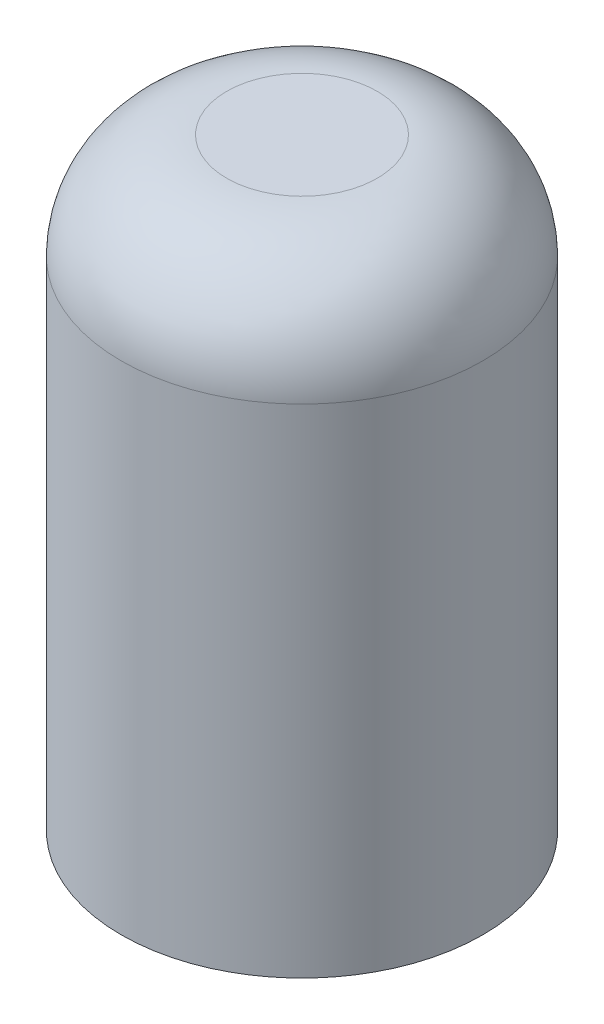
ISO-10303-21;
HEADER;
FILE_DESCRIPTION(('STEP AP214'),'2;1');
FILE_NAME('part.step','',(''),(''),'','','');
FILE_SCHEMA(('AUTOMOTIVE_DESIGN { 1 0 10303 214 1 1 1 1 }'));
ENDSEC;
DATA;
#1=APPLICATION_CONTEXT('core data for automotive mechanical design processes');
#2=APPLICATION_PROTOCOL_DEFINITION('international standard','automotive_design',2000,#1);
#3=PRODUCT_CONTEXT('',#1,'mechanical');
#4=PRODUCT('Part','Part','',(#3));
#5=PRODUCT_RELATED_PRODUCT_CATEGORY('part','',(#4));
#6=PRODUCT_DEFINITION_FORMATION('','',#4);
#7=PRODUCT_DEFINITION_CONTEXT('part definition',#1,'design');
#8=PRODUCT_DEFINITION('design','',#6,#7);
#9=PRODUCT_DEFINITION_SHAPE('','',#8);
#10=(LENGTH_UNIT() NAMED_UNIT(*) SI_UNIT(.MILLI.,.METRE.));
#11=(NAMED_UNIT(*) PLANE_ANGLE_UNIT() SI_UNIT($,.RADIAN.));
#12=(NAMED_UNIT(*) SI_UNIT($,.STERADIAN.) SOLID_ANGLE_UNIT());
#13=UNCERTAINTY_MEASURE_WITH_UNIT(LENGTH_MEASURE(1.E-05),#10,'distance_accuracy_value','');
#14=(GEOMETRIC_REPRESENTATION_CONTEXT(3) GLOBAL_UNCERTAINTY_ASSIGNED_CONTEXT((#13)) GLOBAL_UNIT_ASSIGNED_CONTEXT((#10,
#11,#12)) REPRESENTATION_CONTEXT('',''));
#15=CARTESIAN_POINT('',(0.,0.,0.));
#16=DIRECTION('',(0.,0.,1.));
#17=DIRECTION('',(1.,0.,0.));
#18=AXIS2_PLACEMENT_3D('',#15,#16,#17);
#19=CARTESIAN_POINT('',(0.,0.,0.));
#20=DIRECTION('',(0.,1.,0.));
#21=DIRECTION('',(-1.,0.,0.));
#22=AXIS2_PLACEMENT_3D('',#19,#20,#21);
#23=PLANE('',#22);
#24=CARTESIAN_POINT('',(0.,0.,0.));
#25=DIRECTION('',(0.,1.,0.));
#26=DIRECTION('',(-1.,0.,0.));
#27=AXIS2_PLACEMENT_3D('',#24,#25,#26);
#28=CIRCLE('',#27,57.9999999999998);
#29=CARTESIAN_POINT('',(-57.9999999999998,2.56578741862219E-13,0.));
#30=VERTEX_POINT('',#29);
#31=EDGE_CURVE('E45',#30,#30,#28,.T.);
#32=ORIENTED_EDGE('',*,*,#31,.T.);
#33=EDGE_LOOP('',(#32));
#34=FACE_BOUND('',#33,.T.);
#35=CARTESIAN_POINT('',(0.,1.66533453693773E-13,0.));
#36=DIRECTION('',(0.,1.,0.));
#37=DIRECTION('',(-1.,0.,0.));
#38=AXIS2_PLACEMENT_3D('',#35,#36,#37);
#39=CIRCLE('',#38,60.0000000000001);
#40=CARTESIAN_POINT('',(-60.0000000000001,3.45821745088946E-13,0.));
#41=VERTEX_POINT('',#40);
#42=EDGE_CURVE('E10',#41,#41,#39,.T.);
#43=ORIENTED_EDGE('',*,*,#42,.F.);
#44=EDGE_LOOP('',(#43));
#45=FACE_BOUND('',#44,.T.);
#46=ADVANCED_FACE('F31',(#34,#45),#23,.F.);
#47=CARTESIAN_POINT('',(5.97627637983908E-13,200.,0.));
#48=DIRECTION('',(0.,1.,0.));
#49=DIRECTION('',(-1.,0.,0.));
#50=AXIS2_PLACEMENT_3D('',#47,#48,#49);
#51=CYLINDRICAL_SURFACE('',#50,59.9999999999998);
#52=CARTESIAN_POINT('',(4.93042801336724E-13,165.,0.));
#53=DIRECTION('',(0.,1.,0.));
#54=DIRECTION('',(-1.,0.,0.));
#55=AXIS2_PLACEMENT_3D('',#52,#53,#54);
#56=CIRCLE('',#55,59.9999999999995);
#57=CARTESIAN_POINT('',(-59.999999999999,165.,0.));
#58=VERTEX_POINT('',#57);
#59=EDGE_CURVE('E37',#58,#58,#56,.T.);
#60=ORIENTED_EDGE('',*,*,#59,.F.);
#61=EDGE_LOOP('',(#60));
#62=FACE_BOUND('',#61,.T.);
#63=ORIENTED_EDGE('',*,*,#42,.T.);
#64=EDGE_LOOP('',(#63));
#65=FACE_BOUND('',#64,.T.);
#66=ADVANCED_FACE('F74',(#62,#65),#51,.T.);
#67=CARTESIAN_POINT('',(4.92661467177413E-13,165.,0.));
#68=DIRECTION('',(0.,1.,0.));
#69=DIRECTION('',(-1.,0.,0.));
#70=AXIS2_PLACEMENT_3D('',#67,#68,#69);
#71=DEGENERATE_TOROIDAL_SURFACE('',#70,24.9999999999995,35.,.T.);
#72=CARTESIAN_POINT('',(5.97627637983908E-13,200.,0.));
#73=DIRECTION('',(0.,1.,0.));
#74=DIRECTION('',(-1.,0.,0.));
#75=AXIS2_PLACEMENT_3D('',#72,#73,#74);
#76=CIRCLE('',#75,24.9999999999994);
#77=CARTESIAN_POINT('',(-24.9999999999988,200.,0.));
#78=VERTEX_POINT('',#77);
#79=EDGE_CURVE('E41',#78,#78,#76,.T.);
#80=ORIENTED_EDGE('',*,*,#79,.F.);
#81=EDGE_LOOP('',(#80));
#82=FACE_BOUND('',#81,.T.);
#83=ORIENTED_EDGE('',*,*,#59,.T.);
#84=EDGE_LOOP('',(#83));
#85=FACE_BOUND('',#84,.T.);
#86=ADVANCED_FACE('F79',(#82,#85),#71,.T.);
#87=CARTESIAN_POINT('',(25.,200.,0.));
#88=DIRECTION('',(0.,-1.,0.));
#89=DIRECTION('',(1.,0.,0.));
#90=AXIS2_PLACEMENT_3D('',#87,#88,#89);
#91=PLANE('',#90);
#92=ORIENTED_EDGE('',*,*,#79,.T.);
#93=EDGE_LOOP('',(#92));
#94=FACE_BOUND('',#93,.T.);
#95=ADVANCED_FACE('F71',(#94),#91,.F.);
#96=CARTESIAN_POINT('',(5.97627637983908E-13,200.,0.));
#97=DIRECTION('',(0.,1.,0.));
#98=DIRECTION('',(-1.,0.,0.));
#99=AXIS2_PLACEMENT_3D('',#96,#97,#98);
#100=CYLINDRICAL_SURFACE('',#99,57.9999999999998);
#101=CARTESIAN_POINT('',(4.92661467177414E-13,165.,0.));
#102=DIRECTION('',(0.,1.,0.));
#103=DIRECTION('',(-1.,0.,0.));
#104=AXIS2_PLACEMENT_3D('',#101,#102,#103);
#105=CIRCLE('',#104,57.9999999999995);
#106=CARTESIAN_POINT('',(-57.999999999999,165.,0.));
#107=VERTEX_POINT('',#106);
#108=EDGE_CURVE('E50',#107,#107,#105,.T.);
#109=ORIENTED_EDGE('',*,*,#108,.T.);
#110=EDGE_LOOP('',(#109));
#111=FACE_BOUND('',#110,.T.);
#112=ORIENTED_EDGE('',*,*,#31,.F.);
#113=EDGE_LOOP('',(#112));
#114=FACE_BOUND('',#113,.T.);
#115=ADVANCED_FACE('F57',(#111,#114),#100,.F.);
#116=CARTESIAN_POINT('',(4.92661467177413E-13,165.,0.));
#117=DIRECTION('',(0.,1.,0.));
#118=DIRECTION('',(-1.,0.,0.));
#119=AXIS2_PLACEMENT_3D('',#116,#117,#118);
#120=DEGENERATE_TOROIDAL_SURFACE('',#119,24.9999999999995,33.,.T.);
#121=CARTESIAN_POINT('',(5.91270027444758E-13,198.,0.));
#122=DIRECTION('',(0.,1.,0.));
#123=DIRECTION('',(-1.,0.,0.));
#124=AXIS2_PLACEMENT_3D('',#121,#122,#123);
#125=CIRCLE('',#124,24.9999999999994);
#126=CARTESIAN_POINT('',(-24.9999999999988,198.,0.));
#127=VERTEX_POINT('',#126);
#128=EDGE_CURVE('E51',#127,#127,#125,.T.);
#129=ORIENTED_EDGE('',*,*,#128,.T.);
#130=EDGE_LOOP('',(#129));
#131=FACE_BOUND('',#130,.T.);
#132=ORIENTED_EDGE('',*,*,#108,.F.);
#133=EDGE_LOOP('',(#132));
#134=FACE_BOUND('',#133,.T.);
#135=ADVANCED_FACE('F60',(#131,#134),#120,.F.);
#136=CARTESIAN_POINT('',(25.,198.,0.));
#137=DIRECTION('',(0.,-1.,0.));
#138=DIRECTION('',(1.,0.,0.));
#139=AXIS2_PLACEMENT_3D('',#136,#137,#138);
#140=PLANE('',#139);
#141=ORIENTED_EDGE('',*,*,#128,.F.);
#142=EDGE_LOOP('',(#141));
#143=FACE_BOUND('',#142,.T.);
#144=ADVANCED_FACE('F62',(#143),#140,.T.);
#145=CLOSED_SHELL('',(#46,#66,#86,#95,#115,#135,#144));
#146=MANIFOLD_SOLID_BREP('B2',#145);
#147=ADVANCED_BREP_SHAPE_REPRESENTATION('',(#18,#146),#14);
#148=SHAPE_DEFINITION_REPRESENTATION(#9,#147);
ENDSEC;
END-ISO-10303-21;
